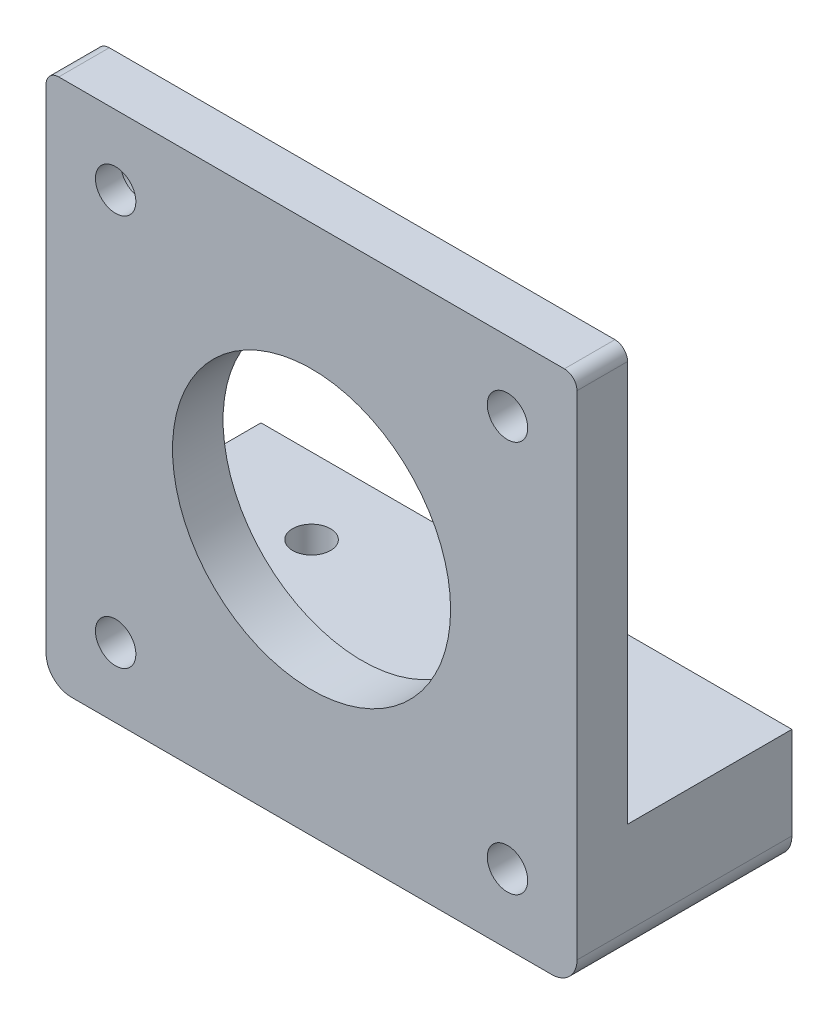
ISO-10303-21;
HEADER;
FILE_DESCRIPTION(('STEP AP214'),'2;1');
FILE_NAME('part.step','',(''),(''),'','','');
FILE_SCHEMA(('AUTOMOTIVE_DESIGN { 1 0 10303 214 1 1 1 1 }'));
ENDSEC;
DATA;
#1=APPLICATION_CONTEXT('core data for automotive mechanical design processes');
#2=APPLICATION_PROTOCOL_DEFINITION('international standard','automotive_design',2000,#1);
#3=PRODUCT_CONTEXT('',#1,'mechanical');
#4=PRODUCT('Part','Part','',(#3));
#5=PRODUCT_RELATED_PRODUCT_CATEGORY('part','',(#4));
#6=PRODUCT_DEFINITION_FORMATION('','',#4);
#7=PRODUCT_DEFINITION_CONTEXT('part definition',#1,'design');
#8=PRODUCT_DEFINITION('design','',#6,#7);
#9=PRODUCT_DEFINITION_SHAPE('','',#8);
#10=(LENGTH_UNIT() NAMED_UNIT(*) SI_UNIT(.MILLI.,.METRE.));
#11=(NAMED_UNIT(*) PLANE_ANGLE_UNIT() SI_UNIT($,.RADIAN.));
#12=(NAMED_UNIT(*) SI_UNIT($,.STERADIAN.) SOLID_ANGLE_UNIT());
#13=UNCERTAINTY_MEASURE_WITH_UNIT(LENGTH_MEASURE(1.E-05),#10,'distance_accuracy_value','');
#14=(GEOMETRIC_REPRESENTATION_CONTEXT(3) GLOBAL_UNCERTAINTY_ASSIGNED_CONTEXT((#13)) GLOBAL_UNIT_ASSIGNED_CONTEXT((#10,
#11,#12)) REPRESENTATION_CONTEXT('',''));
#15=CARTESIAN_POINT('',(0.,0.,0.));
#16=DIRECTION('',(0.,0.,1.));
#17=DIRECTION('',(1.,0.,0.));
#18=AXIS2_PLACEMENT_3D('',#15,#16,#17);
#19=CARTESIAN_POINT('',(5.5,36.5,-4.));
#20=DIRECTION('',(0.,0.,-1.));
#21=DIRECTION('',(-1.,0.,0.));
#22=AXIS2_PLACEMENT_3D('',#19,#20,#21);
#23=CYLINDRICAL_SURFACE('',#22,2.5);
#24=CARTESIAN_POINT('',(5.5,36.5,-4.));
#25=DIRECTION('',(0.,0.,-1.));
#26=DIRECTION('',(-1.,0.,0.));
#27=AXIS2_PLACEMENT_3D('',#24,#25,#26);
#28=CIRCLE('',#27,2.5);
#29=CARTESIAN_POINT('',(3.,36.5,-4.));
#30=VERTEX_POINT('',#29);
#31=EDGE_CURVE('E137',#30,#30,#28,.T.);
#32=ORIENTED_EDGE('',*,*,#31,.T.);
#33=EDGE_LOOP('',(#32));
#34=FACE_BOUND('',#33,.T.);
#35=CARTESIAN_POINT('',(5.5,36.5,-2.));
#36=DIRECTION('',(0.,0.,-1.));
#37=DIRECTION('',(-1.,0.,0.));
#38=AXIS2_PLACEMENT_3D('',#35,#36,#37);
#39=CIRCLE('',#38,2.5);
#40=CARTESIAN_POINT('',(3.,36.5,-2.));
#41=VERTEX_POINT('',#40);
#42=EDGE_CURVE('E202',#41,#41,#39,.F.);
#43=ORIENTED_EDGE('',*,*,#42,.T.);
#44=EDGE_LOOP('',(#43));
#45=FACE_BOUND('',#44,.T.);
#46=ADVANCED_FACE('F17',(#34,#45),#23,.F.);
#47=CARTESIAN_POINT('',(27.5,0.,-11.));
#48=DIRECTION('',(0.,-1.,0.));
#49=DIRECTION('',(0.,0.,-1.));
#50=AXIS2_PLACEMENT_3D('',#47,#48,#49);
#51=CYLINDRICAL_SURFACE('',#50,3.);
#52=CARTESIAN_POINT('',(27.5,0.,-11.));
#53=DIRECTION('',(0.,-1.,0.));
#54=DIRECTION('',(0.,0.,-1.));
#55=AXIS2_PLACEMENT_3D('',#52,#53,#54);
#56=CIRCLE('',#55,3.);
#57=CARTESIAN_POINT('',(27.5,0.,-14.));
#58=VERTEX_POINT('',#57);
#59=EDGE_CURVE('E191',#58,#58,#56,.T.);
#60=ORIENTED_EDGE('',*,*,#59,.T.);
#61=EDGE_LOOP('',(#60));
#62=FACE_BOUND('',#61,.T.);
#63=CARTESIAN_POINT('',(27.5,9.3,-11.));
#64=DIRECTION('',(0.,-1.,0.));
#65=DIRECTION('',(0.,0.,-1.));
#66=AXIS2_PLACEMENT_3D('',#63,#64,#65);
#67=CIRCLE('',#66,3.);
#68=CARTESIAN_POINT('',(27.5,9.3,-14.));
#69=VERTEX_POINT('',#68);
#70=EDGE_CURVE('E207',#69,#69,#67,.F.);
#71=ORIENTED_EDGE('',*,*,#70,.T.);
#72=EDGE_LOOP('',(#71));
#73=FACE_BOUND('',#72,.T.);
#74=ADVANCED_FACE('F228',(#62,#73),#51,.F.);
#75=CARTESIAN_POINT('',(10.,0.,-11.));
#76=DIRECTION('',(0.,-1.,0.));
#77=DIRECTION('',(0.,0.,-1.));
#78=AXIS2_PLACEMENT_3D('',#75,#76,#77);
#79=CYLINDRICAL_SURFACE('',#78,1.5);
#80=CARTESIAN_POINT('',(10.,0.,-11.));
#81=DIRECTION('',(0.,-1.,0.));
#82=DIRECTION('',(0.,0.,-1.));
#83=AXIS2_PLACEMENT_3D('',#80,#81,#82);
#84=CIRCLE('',#83,1.5);
#85=CARTESIAN_POINT('',(10.,0.,-12.5));
#86=VERTEX_POINT('',#85);
#87=EDGE_CURVE('E188',#86,#86,#84,.T.);
#88=ORIENTED_EDGE('',*,*,#87,.T.);
#89=EDGE_LOOP('',(#88));
#90=FACE_BOUND('',#89,.T.);
#91=CARTESIAN_POINT('',(10.,9.3,-11.));
#92=DIRECTION('',(0.,-1.,0.));
#93=DIRECTION('',(0.,0.,-1.));
#94=AXIS2_PLACEMENT_3D('',#91,#92,#93);
#95=CIRCLE('',#94,1.5);
#96=CARTESIAN_POINT('',(10.,9.3,-12.5));
#97=VERTEX_POINT('',#96);
#98=EDGE_CURVE('E20',#97,#97,#95,.F.);
#99=ORIENTED_EDGE('',*,*,#98,.T.);
#100=EDGE_LOOP('',(#99));
#101=FACE_BOUND('',#100,.T.);
#102=ADVANCED_FACE('F214',(#90,#101),#79,.F.);
#103=CARTESIAN_POINT('',(42.,9.3,-4.));
#104=DIRECTION('',(0.,-1.,0.));
#105=DIRECTION('',(0.,0.,-1.));
#106=AXIS2_PLACEMENT_3D('',#103,#104,#105);
#107=PLANE('',#106);
#108=ORIENTED_EDGE('',*,*,#70,.F.);
#109=EDGE_LOOP('',(#108));
#110=FACE_BOUND('',#109,.T.);
#111=ORIENTED_EDGE('',*,*,#98,.F.);
#112=EDGE_LOOP('',(#111));
#113=FACE_BOUND('',#112,.T.);
#114=DIRECTION('',(0.,0.,1.));
#115=VECTOR('',#114,1.);
#116=CARTESIAN_POINT('',(42.,9.3,0.));
#117=LINE('',#116,#115);
#118=CARTESIAN_POINT('',(42.,9.3,-4.));
#119=VERTEX_POINT('',#118);
#120=CARTESIAN_POINT('',(42.,9.3,-17.));
#121=VERTEX_POINT('',#120);
#122=EDGE_CURVE('E95',#119,#121,#117,.F.);
#123=ORIENTED_EDGE('',*,*,#122,.T.);
#124=DIRECTION('',(1.,0.,0.));
#125=VECTOR('',#124,1.);
#126=CARTESIAN_POINT('',(21.,9.3,-17.));
#127=LINE('',#126,#125);
#128=CARTESIAN_POINT('',(0.,9.3,-17.));
#129=VERTEX_POINT('',#128);
#130=EDGE_CURVE('E103',#121,#129,#127,.F.);
#131=ORIENTED_EDGE('',*,*,#130,.T.);
#132=DIRECTION('',(0.,0.,-1.));
#133=VECTOR('',#132,1.);
#134=CARTESIAN_POINT('',(0.,9.3,0.));
#135=LINE('',#134,#133);
#136=CARTESIAN_POINT('',(0.,9.3,-4.));
#137=VERTEX_POINT('',#136);
#138=EDGE_CURVE('E98',#129,#137,#135,.F.);
#139=ORIENTED_EDGE('',*,*,#138,.T.);
#140=DIRECTION('',(1.,0.,0.));
#141=VECTOR('',#140,1.);
#142=CARTESIAN_POINT('',(21.,9.3,-4.));
#143=LINE('',#142,#141);
#144=EDGE_CURVE('E91',#137,#119,#143,.T.);
#145=ORIENTED_EDGE('',*,*,#144,.T.);
#146=EDGE_LOOP('',(#123,#131,#139,#145));
#147=FACE_BOUND('',#146,.T.);
#148=ADVANCED_FACE('F93',(#110,#113,#147),#107,.F.);
#149=CARTESIAN_POINT('',(41.,41.,0.));
#150=DIRECTION('',(0.,0.,1.));
#151=DIRECTION('',(1.,0.,0.));
#152=AXIS2_PLACEMENT_3D('',#149,#150,#151);
#153=CYLINDRICAL_SURFACE('',#152,1.);
#154=CARTESIAN_POINT('',(41.,41.,0.));
#155=DIRECTION('',(0.,0.,1.));
#156=DIRECTION('',(1.,0.,0.));
#157=AXIS2_PLACEMENT_3D('',#154,#155,#156);
#158=CIRCLE('',#157,1.);
#159=CARTESIAN_POINT('',(41.,42.,0.));
#160=VERTEX_POINT('',#159);
#161=CARTESIAN_POINT('',(42.,41.,0.));
#162=VERTEX_POINT('',#161);
#163=EDGE_CURVE('E33',#160,#162,#158,.F.);
#164=ORIENTED_EDGE('',*,*,#163,.T.);
#165=DIRECTION('',(0.,0.,1.));
#166=VECTOR('',#165,1.);
#167=CARTESIAN_POINT('',(42.,41.,0.));
#168=LINE('',#167,#166);
#169=CARTESIAN_POINT('',(42.,41.,-4.));
#170=VERTEX_POINT('',#169);
#171=EDGE_CURVE('E316',#162,#170,#168,.F.);
#172=ORIENTED_EDGE('',*,*,#171,.T.);
#173=CARTESIAN_POINT('',(41.,41.,-4.));
#174=DIRECTION('',(0.,0.,1.));
#175=DIRECTION('',(1.,0.,0.));
#176=AXIS2_PLACEMENT_3D('',#173,#174,#175);
#177=CIRCLE('',#176,1.);
#178=CARTESIAN_POINT('',(41.,42.,-4.));
#179=VERTEX_POINT('',#178);
#180=EDGE_CURVE('E102',#170,#179,#177,.T.);
#181=ORIENTED_EDGE('',*,*,#180,.T.);
#182=DIRECTION('',(0.,0.,-1.));
#183=VECTOR('',#182,1.);
#184=CARTESIAN_POINT('',(41.,42.,0.));
#185=LINE('',#184,#183);
#186=EDGE_CURVE('E306',#179,#160,#185,.F.);
#187=ORIENTED_EDGE('',*,*,#186,.T.);
#188=EDGE_LOOP('',(#164,#172,#181,#187));
#189=FACE_BOUND('',#188,.T.);
#190=ADVANCED_FACE('F217',(#189),#153,.T.);
#191=CARTESIAN_POINT('',(1.,41.,0.));
#192=DIRECTION('',(0.,0.,1.));
#193=DIRECTION('',(1.,0.,0.));
#194=AXIS2_PLACEMENT_3D('',#191,#192,#193);
#195=CYLINDRICAL_SURFACE('',#194,1.);
#196=CARTESIAN_POINT('',(1.,41.,0.));
#197=DIRECTION('',(0.,0.,1.));
#198=DIRECTION('',(1.,0.,0.));
#199=AXIS2_PLACEMENT_3D('',#196,#197,#198);
#200=CIRCLE('',#199,1.);
#201=CARTESIAN_POINT('',(0.,41.,0.));
#202=VERTEX_POINT('',#201);
#203=CARTESIAN_POINT('',(1.,42.,0.));
#204=VERTEX_POINT('',#203);
#205=EDGE_CURVE('E205',#202,#204,#200,.F.);
#206=ORIENTED_EDGE('',*,*,#205,.T.);
#207=DIRECTION('',(0.,0.,-1.));
#208=VECTOR('',#207,1.);
#209=CARTESIAN_POINT('',(1.00000000000001,42.,0.));
#210=LINE('',#209,#208);
#211=CARTESIAN_POINT('',(1.,42.,-4.));
#212=VERTEX_POINT('',#211);
#213=EDGE_CURVE('E184',#204,#212,#210,.T.);
#214=ORIENTED_EDGE('',*,*,#213,.T.);
#215=CARTESIAN_POINT('',(1.,41.,-4.));
#216=DIRECTION('',(0.,0.,1.));
#217=DIRECTION('',(1.,0.,0.));
#218=AXIS2_PLACEMENT_3D('',#215,#216,#217);
#219=CIRCLE('',#218,1.);
#220=CARTESIAN_POINT('',(0.,41.,-4.));
#221=VERTEX_POINT('',#220);
#222=EDGE_CURVE('E199',#212,#221,#219,.T.);
#223=ORIENTED_EDGE('',*,*,#222,.T.);
#224=DIRECTION('',(0.,0.,-1.));
#225=VECTOR('',#224,1.);
#226=CARTESIAN_POINT('',(0.,41.,0.));
#227=LINE('',#226,#225);
#228=EDGE_CURVE('E142',#221,#202,#227,.F.);
#229=ORIENTED_EDGE('',*,*,#228,.T.);
#230=EDGE_LOOP('',(#206,#214,#223,#229));
#231=FACE_BOUND('',#230,.T.);
#232=ADVANCED_FACE('F225',(#231),#195,.T.);
#233=CARTESIAN_POINT('',(5.5,36.5,-2.));
#234=DIRECTION('',(0.,0.,1.));
#235=DIRECTION('',(1.,0.,0.));
#236=AXIS2_PLACEMENT_3D('',#233,#234,#235);
#237=PLANE('',#236);
#238=CARTESIAN_POINT('',(5.5,36.5,-2.));
#239=DIRECTION('',(0.,0.,-1.));
#240=DIRECTION('',(-1.,0.,0.));
#241=AXIS2_PLACEMENT_3D('',#238,#239,#240);
#242=CIRCLE('',#241,1.6);
#243=CARTESIAN_POINT('',(3.9,36.5,-2.));
#244=VERTEX_POINT('',#243);
#245=EDGE_CURVE('E178',#244,#244,#242,.F.);
#246=ORIENTED_EDGE('',*,*,#245,.T.);
#247=EDGE_LOOP('',(#246));
#248=FACE_BOUND('',#247,.T.);
#249=ORIENTED_EDGE('',*,*,#42,.F.);
#250=EDGE_LOOP('',(#249));
#251=FACE_BOUND('',#250,.T.);
#252=ADVANCED_FACE('F287',(#248,#251),#237,.F.);
#253=CARTESIAN_POINT('',(21.,4.65,-17.));
#254=DIRECTION('',(0.,0.,1.));
#255=DIRECTION('',(1.,0.,0.));
#256=AXIS2_PLACEMENT_3D('',#253,#254,#255);
#257=PLANE('',#256);
#258=CARTESIAN_POINT('',(36.5,5.50000000000001,-17.));
#259=DIRECTION('',(0.,0.,-1.));
#260=DIRECTION('',(-1.,0.,0.));
#261=AXIS2_PLACEMENT_3D('',#258,#259,#260);
#262=CIRCLE('',#261,1.6);
#263=CARTESIAN_POINT('',(34.9,5.50000000000001,-17.));
#264=VERTEX_POINT('',#263);
#265=EDGE_CURVE('E172',#264,#264,#262,.F.);
#266=ORIENTED_EDGE('',*,*,#265,.T.);
#267=EDGE_LOOP('',(#266));
#268=FACE_BOUND('',#267,.T.);
#269=CARTESIAN_POINT('',(5.5,5.50000000000001,-17.));
#270=DIRECTION('',(0.,0.,-1.));
#271=DIRECTION('',(-1.,0.,0.));
#272=AXIS2_PLACEMENT_3D('',#269,#270,#271);
#273=CIRCLE('',#272,1.6);
#274=CARTESIAN_POINT('',(3.9,5.50000000000001,-17.));
#275=VERTEX_POINT('',#274);
#276=EDGE_CURVE('E181',#275,#275,#273,.F.);
#277=ORIENTED_EDGE('',*,*,#276,.T.);
#278=EDGE_LOOP('',(#277));
#279=FACE_BOUND('',#278,.T.);
#280=DIRECTION('',(1.,0.,0.));
#281=VECTOR('',#280,1.);
#282=CARTESIAN_POINT('',(0.,0.,-17.));
#283=LINE('',#282,#281);
#284=CARTESIAN_POINT('',(40.,0.,-17.));
#285=VERTEX_POINT('',#284);
#286=CARTESIAN_POINT('',(2.,0.,-17.));
#287=VERTEX_POINT('',#286);
#288=EDGE_CURVE('E130',#285,#287,#283,.F.);
#289=ORIENTED_EDGE('',*,*,#288,.T.);
#290=CARTESIAN_POINT('',(2.,2.,-17.));
#291=DIRECTION('',(0.,0.,1.));
#292=DIRECTION('',(1.,0.,0.));
#293=AXIS2_PLACEMENT_3D('',#290,#291,#292);
#294=CIRCLE('',#293,2.);
#295=CARTESIAN_POINT('',(0.,2.,-17.));
#296=VERTEX_POINT('',#295);
#297=EDGE_CURVE('E194',#296,#287,#294,.T.);
#298=ORIENTED_EDGE('',*,*,#297,.F.);
#299=DIRECTION('',(0.,1.,0.));
#300=VECTOR('',#299,1.);
#301=CARTESIAN_POINT('',(0.,42.,-17.));
#302=LINE('',#301,#300);
#303=EDGE_CURVE('E134',#296,#129,#302,.T.);
#304=ORIENTED_EDGE('',*,*,#303,.T.);
#305=ORIENTED_EDGE('',*,*,#130,.F.);
#306=DIRECTION('',(0.,1.,0.));
#307=VECTOR('',#306,1.);
#308=CARTESIAN_POINT('',(42.,0.,-17.));
#309=LINE('',#308,#307);
#310=CARTESIAN_POINT('',(42.,2.,-17.));
#311=VERTEX_POINT('',#310);
#312=EDGE_CURVE('E118',#121,#311,#309,.F.);
#313=ORIENTED_EDGE('',*,*,#312,.T.);
#314=CARTESIAN_POINT('',(40.,2.,-17.));
#315=DIRECTION('',(0.,0.,1.));
#316=DIRECTION('',(1.,0.,0.));
#317=AXIS2_PLACEMENT_3D('',#314,#315,#316);
#318=CIRCLE('',#317,2.);
#319=EDGE_CURVE('E185',#285,#311,#318,.T.);
#320=ORIENTED_EDGE('',*,*,#319,.F.);
#321=EDGE_LOOP('',(#289,#298,#304,#305,#313,#320));
#322=FACE_BOUND('',#321,.T.);
#323=ADVANCED_FACE('F283',(#268,#279,#322),#257,.F.);
#324=CARTESIAN_POINT('',(21.,21.,-4.));
#325=DIRECTION('',(0.,0.,1.));
#326=DIRECTION('',(1.,0.,0.));
#327=AXIS2_PLACEMENT_3D('',#324,#325,#326);
#328=PLANE('',#327);
#329=CARTESIAN_POINT('',(21.,21.,-4.));
#330=DIRECTION('',(0.,0.,1.));
#331=DIRECTION('',(1.,0.,0.));
#332=AXIS2_PLACEMENT_3D('',#329,#330,#331);
#333=CIRCLE('',#332,11.);
#334=CARTESIAN_POINT('',(32.,21.,-4.));
#335=VERTEX_POINT('',#334);
#336=EDGE_CURVE('E169',#335,#335,#333,.T.);
#337=ORIENTED_EDGE('',*,*,#336,.T.);
#338=EDGE_LOOP('',(#337));
#339=FACE_BOUND('',#338,.T.);
#340=CARTESIAN_POINT('',(36.5,36.5,-4.));
#341=DIRECTION('',(0.,0.,-1.));
#342=DIRECTION('',(-1.,0.,0.));
#343=AXIS2_PLACEMENT_3D('',#340,#341,#342);
#344=CIRCLE('',#343,1.6);
#345=CARTESIAN_POINT('',(34.9,36.5,-4.));
#346=VERTEX_POINT('',#345);
#347=EDGE_CURVE('E175',#346,#346,#344,.F.);
#348=ORIENTED_EDGE('',*,*,#347,.T.);
#349=EDGE_LOOP('',(#348));
#350=FACE_BOUND('',#349,.T.);
#351=ORIENTED_EDGE('',*,*,#31,.F.);
#352=EDGE_LOOP('',(#351));
#353=FACE_BOUND('',#352,.T.);
#354=DIRECTION('',(1.,0.,0.));
#355=VECTOR('',#354,1.);
#356=CARTESIAN_POINT('',(42.,42.,-4.));
#357=LINE('',#356,#355);
#358=EDGE_CURVE('E305',#212,#179,#357,.T.);
#359=ORIENTED_EDGE('',*,*,#358,.T.);
#360=ORIENTED_EDGE('',*,*,#180,.F.);
#361=DIRECTION('',(0.,1.,0.));
#362=VECTOR('',#361,1.);
#363=CARTESIAN_POINT('',(42.,0.,-4.));
#364=LINE('',#363,#362);
#365=EDGE_CURVE('E106',#170,#119,#364,.F.);
#366=ORIENTED_EDGE('',*,*,#365,.T.);
#367=ORIENTED_EDGE('',*,*,#144,.F.);
#368=DIRECTION('',(0.,1.,0.));
#369=VECTOR('',#368,1.);
#370=CARTESIAN_POINT('',(0.,42.,-4.));
#371=LINE('',#370,#369);
#372=EDGE_CURVE('E140',#137,#221,#371,.T.);
#373=ORIENTED_EDGE('',*,*,#372,.T.);
#374=ORIENTED_EDGE('',*,*,#222,.F.);
#375=EDGE_LOOP('',(#359,#360,#366,#367,#373,#374));
#376=FACE_BOUND('',#375,.T.);
#377=ADVANCED_FACE('F108',(#339,#350,#353,#376),#328,.F.);
#378=CARTESIAN_POINT('',(0.,42.,0.));
#379=DIRECTION('',(1.,0.,0.));
#380=DIRECTION('',(0.,0.,-1.));
#381=AXIS2_PLACEMENT_3D('',#378,#379,#380);
#382=PLANE('',#381);
#383=ORIENTED_EDGE('',*,*,#372,.F.);
#384=ORIENTED_EDGE('',*,*,#138,.F.);
#385=ORIENTED_EDGE('',*,*,#303,.F.);
#386=DIRECTION('',(0.,0.,1.));
#387=VECTOR('',#386,1.);
#388=CARTESIAN_POINT('',(0.,2.,0.));
#389=LINE('',#388,#387);
#390=CARTESIAN_POINT('',(0.,2.,0.));
#391=VERTEX_POINT('',#390);
#392=EDGE_CURVE('E133',#391,#296,#389,.F.);
#393=ORIENTED_EDGE('',*,*,#392,.F.);
#394=DIRECTION('',(0.,1.,0.));
#395=VECTOR('',#394,1.);
#396=CARTESIAN_POINT('',(0.,21.,0.));
#397=LINE('',#396,#395);
#398=EDGE_CURVE('E168',#202,#391,#397,.F.);
#399=ORIENTED_EDGE('',*,*,#398,.F.);
#400=ORIENTED_EDGE('',*,*,#228,.F.);
#401=EDGE_LOOP('',(#383,#384,#385,#393,#399,#400));
#402=FACE_BOUND('',#401,.T.);
#403=ADVANCED_FACE('F276',(#402),#382,.F.);
#404=CARTESIAN_POINT('',(2.,2.,0.));
#405=DIRECTION('',(0.,0.,1.));
#406=DIRECTION('',(1.,0.,0.));
#407=AXIS2_PLACEMENT_3D('',#404,#405,#406);
#408=CYLINDRICAL_SURFACE('',#407,2.);
#409=CARTESIAN_POINT('',(2.,2.,0.));
#410=DIRECTION('',(0.,0.,1.));
#411=DIRECTION('',(1.,0.,0.));
#412=AXIS2_PLACEMENT_3D('',#409,#410,#411);
#413=CIRCLE('',#412,2.);
#414=CARTESIAN_POINT('',(2.,0.,0.));
#415=VERTEX_POINT('',#414);
#416=EDGE_CURVE('E165',#391,#415,#413,.T.);
#417=ORIENTED_EDGE('',*,*,#416,.F.);
#418=ORIENTED_EDGE('',*,*,#392,.T.);
#419=ORIENTED_EDGE('',*,*,#297,.T.);
#420=DIRECTION('',(0.,0.,1.));
#421=VECTOR('',#420,1.);
#422=CARTESIAN_POINT('',(2.,0.,0.));
#423=LINE('',#422,#421);
#424=EDGE_CURVE('E132',#287,#415,#423,.T.);
#425=ORIENTED_EDGE('',*,*,#424,.T.);
#426=EDGE_LOOP('',(#417,#418,#419,#425));
#427=FACE_BOUND('',#426,.T.);
#428=ADVANCED_FACE('F272',(#427),#408,.T.);
#429=CARTESIAN_POINT('',(0.,0.,0.));
#430=DIRECTION('',(0.,1.,0.));
#431=DIRECTION('',(0.,0.,1.));
#432=AXIS2_PLACEMENT_3D('',#429,#430,#431);
#433=PLANE('',#432);
#434=ORIENTED_EDGE('',*,*,#87,.F.);
#435=EDGE_LOOP('',(#434));
#436=FACE_BOUND('',#435,.T.);
#437=ORIENTED_EDGE('',*,*,#59,.F.);
#438=EDGE_LOOP('',(#437));
#439=FACE_BOUND('',#438,.T.);
#440=DIRECTION('',(1.,0.,0.));
#441=VECTOR('',#440,1.);
#442=CARTESIAN_POINT('',(21.,0.,0.));
#443=LINE('',#442,#441);
#444=CARTESIAN_POINT('',(40.,0.,0.));
#445=VERTEX_POINT('',#444);
#446=EDGE_CURVE('E164',#415,#445,#443,.T.);
#447=ORIENTED_EDGE('',*,*,#446,.F.);
#448=ORIENTED_EDGE('',*,*,#424,.F.);
#449=ORIENTED_EDGE('',*,*,#288,.F.);
#450=DIRECTION('',(0.,0.,1.));
#451=VECTOR('',#450,1.);
#452=CARTESIAN_POINT('',(40.,0.,0.));
#453=LINE('',#452,#451);
#454=EDGE_CURVE('E112',#445,#285,#453,.F.);
#455=ORIENTED_EDGE('',*,*,#454,.F.);
#456=EDGE_LOOP('',(#447,#448,#449,#455));
#457=FACE_BOUND('',#456,.T.);
#458=ADVANCED_FACE('F268',(#436,#439,#457),#433,.F.);
#459=CARTESIAN_POINT('',(40.,2.,0.));
#460=DIRECTION('',(0.,0.,1.));
#461=DIRECTION('',(1.,0.,0.));
#462=AXIS2_PLACEMENT_3D('',#459,#460,#461);
#463=CYLINDRICAL_SURFACE('',#462,2.);
#464=CARTESIAN_POINT('',(40.,2.,0.));
#465=DIRECTION('',(0.,0.,1.));
#466=DIRECTION('',(1.,0.,0.));
#467=AXIS2_PLACEMENT_3D('',#464,#465,#466);
#468=CIRCLE('',#467,2.);
#469=CARTESIAN_POINT('',(42.,2.,0.));
#470=VERTEX_POINT('',#469);
#471=EDGE_CURVE('E160',#445,#470,#468,.T.);
#472=ORIENTED_EDGE('',*,*,#471,.F.);
#473=ORIENTED_EDGE('',*,*,#454,.T.);
#474=ORIENTED_EDGE('',*,*,#319,.T.);
#475=DIRECTION('',(0.,0.,1.));
#476=VECTOR('',#475,1.);
#477=CARTESIAN_POINT('',(42.,2.,0.));
#478=LINE('',#477,#476);
#479=EDGE_CURVE('E120',#311,#470,#478,.T.);
#480=ORIENTED_EDGE('',*,*,#479,.T.);
#481=EDGE_LOOP('',(#472,#473,#474,#480));
#482=FACE_BOUND('',#481,.T.);
#483=ADVANCED_FACE('F265',(#482),#463,.T.);
#484=CARTESIAN_POINT('',(42.,0.,0.));
#485=DIRECTION('',(-1.,0.,0.));
#486=DIRECTION('',(0.,0.,1.));
#487=AXIS2_PLACEMENT_3D('',#484,#485,#486);
#488=PLANE('',#487);
#489=DIRECTION('',(0.,1.,0.));
#490=VECTOR('',#489,1.);
#491=CARTESIAN_POINT('',(42.,21.,0.));
#492=LINE('',#491,#490);
#493=EDGE_CURVE('E163',#470,#162,#492,.T.);
#494=ORIENTED_EDGE('',*,*,#493,.F.);
#495=ORIENTED_EDGE('',*,*,#479,.F.);
#496=ORIENTED_EDGE('',*,*,#312,.F.);
#497=ORIENTED_EDGE('',*,*,#122,.F.);
#498=ORIENTED_EDGE('',*,*,#365,.F.);
#499=ORIENTED_EDGE('',*,*,#171,.F.);
#500=EDGE_LOOP('',(#494,#495,#496,#497,#498,#499));
#501=FACE_BOUND('',#500,.T.);
#502=ADVANCED_FACE('F116',(#501),#488,.F.);
#503=CARTESIAN_POINT('',(42.,42.,0.));
#504=DIRECTION('',(0.,-1.,0.));
#505=DIRECTION('',(0.,0.,-1.));
#506=AXIS2_PLACEMENT_3D('',#503,#504,#505);
#507=PLANE('',#506);
#508=DIRECTION('',(1.,0.,0.));
#509=VECTOR('',#508,1.);
#510=CARTESIAN_POINT('',(21.,42.,0.));
#511=LINE('',#510,#509);
#512=EDGE_CURVE('E159',#160,#204,#511,.F.);
#513=ORIENTED_EDGE('',*,*,#512,.F.);
#514=ORIENTED_EDGE('',*,*,#186,.F.);
#515=ORIENTED_EDGE('',*,*,#358,.F.);
#516=ORIENTED_EDGE('',*,*,#213,.F.);
#517=EDGE_LOOP('',(#513,#514,#515,#516));
#518=FACE_BOUND('',#517,.T.);
#519=ADVANCED_FACE('F258',(#518),#507,.F.);
#520=CARTESIAN_POINT('',(5.5,5.50000000000001,-17.));
#521=DIRECTION('',(0.,0.,-1.));
#522=DIRECTION('',(-1.,0.,0.));
#523=AXIS2_PLACEMENT_3D('',#520,#521,#522);
#524=CYLINDRICAL_SURFACE('',#523,1.6);
#525=ORIENTED_EDGE('',*,*,#276,.F.);
#526=EDGE_LOOP('',(#525));
#527=FACE_BOUND('',#526,.T.);
#528=CARTESIAN_POINT('',(5.5,5.50000000000001,0.));
#529=DIRECTION('',(0.,0.,-1.));
#530=DIRECTION('',(-1.,0.,0.));
#531=AXIS2_PLACEMENT_3D('',#528,#529,#530);
#532=CIRCLE('',#531,1.6);
#533=CARTESIAN_POINT('',(3.9,5.50000000000001,0.));
#534=VERTEX_POINT('',#533);
#535=EDGE_CURVE('E156',#534,#534,#532,.T.);
#536=ORIENTED_EDGE('',*,*,#535,.F.);
#537=EDGE_LOOP('',(#536));
#538=FACE_BOUND('',#537,.T.);
#539=ADVANCED_FACE('F254',(#527,#538),#524,.F.);
#540=CARTESIAN_POINT('',(5.5,36.5,-17.));
#541=DIRECTION('',(0.,0.,-1.));
#542=DIRECTION('',(-1.,0.,0.));
#543=AXIS2_PLACEMENT_3D('',#540,#541,#542);
#544=CYLINDRICAL_SURFACE('',#543,1.6);
#545=CARTESIAN_POINT('',(5.5,36.5,0.));
#546=DIRECTION('',(0.,0.,-1.));
#547=DIRECTION('',(-1.,0.,0.));
#548=AXIS2_PLACEMENT_3D('',#545,#546,#547);
#549=CIRCLE('',#548,1.6);
#550=CARTESIAN_POINT('',(3.9,36.5,0.));
#551=VERTEX_POINT('',#550);
#552=EDGE_CURVE('E153',#551,#551,#549,.T.);
#553=ORIENTED_EDGE('',*,*,#552,.F.);
#554=EDGE_LOOP('',(#553));
#555=FACE_BOUND('',#554,.T.);
#556=ORIENTED_EDGE('',*,*,#245,.F.);
#557=EDGE_LOOP('',(#556));
#558=FACE_BOUND('',#557,.T.);
#559=ADVANCED_FACE('F250',(#555,#558),#544,.F.);
#560=CARTESIAN_POINT('',(36.5,36.5,-17.));
#561=DIRECTION('',(0.,0.,-1.));
#562=DIRECTION('',(-1.,0.,0.));
#563=AXIS2_PLACEMENT_3D('',#560,#561,#562);
#564=CYLINDRICAL_SURFACE('',#563,1.6);
#565=CARTESIAN_POINT('',(36.5,36.5,0.));
#566=DIRECTION('',(0.,0.,-1.));
#567=DIRECTION('',(-1.,0.,0.));
#568=AXIS2_PLACEMENT_3D('',#565,#566,#567);
#569=CIRCLE('',#568,1.6);
#570=CARTESIAN_POINT('',(34.9,36.5,0.));
#571=VERTEX_POINT('',#570);
#572=EDGE_CURVE('E150',#571,#571,#569,.T.);
#573=ORIENTED_EDGE('',*,*,#572,.F.);
#574=EDGE_LOOP('',(#573));
#575=FACE_BOUND('',#574,.T.);
#576=ORIENTED_EDGE('',*,*,#347,.F.);
#577=EDGE_LOOP('',(#576));
#578=FACE_BOUND('',#577,.T.);
#579=ADVANCED_FACE('F246',(#575,#578),#564,.F.);
#580=CARTESIAN_POINT('',(36.5,5.50000000000001,-17.));
#581=DIRECTION('',(0.,0.,-1.));
#582=DIRECTION('',(-1.,0.,0.));
#583=AXIS2_PLACEMENT_3D('',#580,#581,#582);
#584=CYLINDRICAL_SURFACE('',#583,1.6);
#585=ORIENTED_EDGE('',*,*,#265,.F.);
#586=EDGE_LOOP('',(#585));
#587=FACE_BOUND('',#586,.T.);
#588=CARTESIAN_POINT('',(36.5,5.50000000000001,0.));
#589=DIRECTION('',(0.,0.,-1.));
#590=DIRECTION('',(-1.,0.,0.));
#591=AXIS2_PLACEMENT_3D('',#588,#589,#590);
#592=CIRCLE('',#591,1.6);
#593=CARTESIAN_POINT('',(34.9,5.50000000000001,0.));
#594=VERTEX_POINT('',#593);
#595=EDGE_CURVE('E26',#594,#594,#592,.T.);
#596=ORIENTED_EDGE('',*,*,#595,.F.);
#597=EDGE_LOOP('',(#596));
#598=FACE_BOUND('',#597,.T.);
#599=ADVANCED_FACE('F239',(#587,#598),#584,.F.);
#600=CARTESIAN_POINT('',(21.,21.,0.));
#601=DIRECTION('',(0.,0.,1.));
#602=DIRECTION('',(1.,0.,0.));
#603=AXIS2_PLACEMENT_3D('',#600,#601,#602);
#604=CYLINDRICAL_SURFACE('',#603,11.);
#605=CARTESIAN_POINT('',(21.,21.,0.));
#606=DIRECTION('',(0.,0.,1.));
#607=DIRECTION('',(1.,0.,0.));
#608=AXIS2_PLACEMENT_3D('',#605,#606,#607);
#609=CIRCLE('',#608,11.);
#610=CARTESIAN_POINT('',(32.,21.,0.));
#611=VERTEX_POINT('',#610);
#612=EDGE_CURVE('E11',#611,#611,#609,.F.);
#613=ORIENTED_EDGE('',*,*,#612,.F.);
#614=EDGE_LOOP('',(#613));
#615=FACE_BOUND('',#614,.T.);
#616=ORIENTED_EDGE('',*,*,#336,.F.);
#617=EDGE_LOOP('',(#616));
#618=FACE_BOUND('',#617,.T.);
#619=ADVANCED_FACE('F233',(#615,#618),#604,.F.);
#620=CARTESIAN_POINT('',(21.,21.,0.));
#621=DIRECTION('',(0.,0.,1.));
#622=DIRECTION('',(1.,0.,0.));
#623=AXIS2_PLACEMENT_3D('',#620,#621,#622);
#624=PLANE('',#623);
#625=ORIENTED_EDGE('',*,*,#612,.T.);
#626=EDGE_LOOP('',(#625));
#627=FACE_BOUND('',#626,.T.);
#628=ORIENTED_EDGE('',*,*,#595,.T.);
#629=EDGE_LOOP('',(#628));
#630=FACE_BOUND('',#629,.T.);
#631=ORIENTED_EDGE('',*,*,#572,.T.);
#632=EDGE_LOOP('',(#631));
#633=FACE_BOUND('',#632,.T.);
#634=ORIENTED_EDGE('',*,*,#552,.T.);
#635=EDGE_LOOP('',(#634));
#636=FACE_BOUND('',#635,.T.);
#637=ORIENTED_EDGE('',*,*,#535,.T.);
#638=EDGE_LOOP('',(#637));
#639=FACE_BOUND('',#638,.T.);
#640=ORIENTED_EDGE('',*,*,#163,.F.);
#641=ORIENTED_EDGE('',*,*,#512,.T.);
#642=ORIENTED_EDGE('',*,*,#205,.F.);
#643=ORIENTED_EDGE('',*,*,#398,.T.);
#644=ORIENTED_EDGE('',*,*,#416,.T.);
#645=ORIENTED_EDGE('',*,*,#446,.T.);
#646=ORIENTED_EDGE('',*,*,#471,.T.);
#647=ORIENTED_EDGE('',*,*,#493,.T.);
#648=EDGE_LOOP('',(#640,#641,#642,#643,#644,#645,#646,#647));
#649=FACE_BOUND('',#648,.T.);
#650=ADVANCED_FACE('F231',(#627,#630,#633,#636,#639,#649),#624,.T.);
#651=CLOSED_SHELL('',(#46,#74,#102,#148,#190,#232,#252,#323,#377,#403,#428,#458,#483,#502,#519,
#539,#559,#579,#599,#619,#650));
#652=MANIFOLD_SOLID_BREP('B1',#651);
#653=ADVANCED_BREP_SHAPE_REPRESENTATION('',(#18,#652),#14);
#654=SHAPE_DEFINITION_REPRESENTATION(#9,#653);
ENDSEC;
END-ISO-10303-21;
